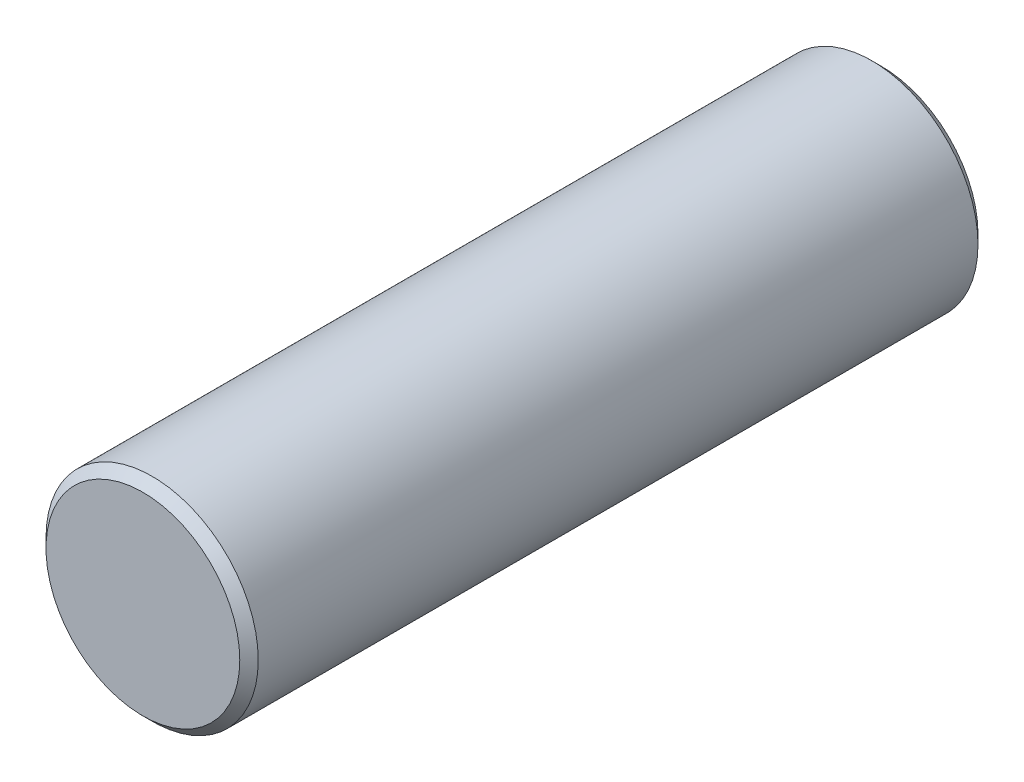
ISO-10303-21;
HEADER;
FILE_DESCRIPTION(('STEP AP214'),'2;1');
FILE_NAME('part.step','',(''),(''),'','','');
FILE_SCHEMA(('AUTOMOTIVE_DESIGN { 1 0 10303 214 1 1 1 1 }'));
ENDSEC;
DATA;
#1=APPLICATION_CONTEXT('core data for automotive mechanical design processes');
#2=APPLICATION_PROTOCOL_DEFINITION('international standard','automotive_design',2000,#1);
#3=PRODUCT_CONTEXT('',#1,'mechanical');
#4=PRODUCT('Part','Part','',(#3));
#5=PRODUCT_RELATED_PRODUCT_CATEGORY('part','',(#4));
#6=PRODUCT_DEFINITION_FORMATION('','',#4);
#7=PRODUCT_DEFINITION_CONTEXT('part definition',#1,'design');
#8=PRODUCT_DEFINITION('design','',#6,#7);
#9=PRODUCT_DEFINITION_SHAPE('','',#8);
#10=(LENGTH_UNIT() NAMED_UNIT(*) SI_UNIT(.MILLI.,.METRE.));
#11=(NAMED_UNIT(*) PLANE_ANGLE_UNIT() SI_UNIT($,.RADIAN.));
#12=(NAMED_UNIT(*) SI_UNIT($,.STERADIAN.) SOLID_ANGLE_UNIT());
#13=UNCERTAINTY_MEASURE_WITH_UNIT(LENGTH_MEASURE(1.E-05),#10,'distance_accuracy_value','');
#14=(GEOMETRIC_REPRESENTATION_CONTEXT(3) GLOBAL_UNCERTAINTY_ASSIGNED_CONTEXT((#13)) GLOBAL_UNIT_ASSIGNED_CONTEXT((#10,
#11,#12)) REPRESENTATION_CONTEXT('',''));
#15=CARTESIAN_POINT('',(0.,0.,0.));
#16=DIRECTION('',(0.,0.,1.));
#17=DIRECTION('',(1.,0.,0.));
#18=AXIS2_PLACEMENT_3D('',#15,#16,#17);
#19=CARTESIAN_POINT('',(0.,0.,80.));
#20=DIRECTION('',(0.,0.,-1.));
#21=DIRECTION('',(-1.,0.,0.));
#22=AXIS2_PLACEMENT_3D('',#19,#20,#21);
#23=CYLINDRICAL_SURFACE('',#22,11.5);
#24=CARTESIAN_POINT('',(0.,-11.5,12.5));
#25=CARTESIAN_POINT('',(-0.138677726510867,-11.4999974393954,12.5000047650593));
#26=CARTESIAN_POINT('',(-0.277413225798993,-11.4974660329192,12.5115778653683));
#27=CARTESIAN_POINT('',(-0.550944911814634,-11.4876122322648,12.5575172654708));
#28=CARTESIAN_POINT('',(-0.685738187177295,-11.4802863862567,12.5918999876431));
#29=CARTESIAN_POINT('',(-0.947392658892481,-11.4616595565263,12.6823319620601));
#30=CARTESIAN_POINT('',(-1.07426193195675,-11.4503627008652,12.738358720222));
#31=CARTESIAN_POINT('',(-1.31679476574259,-11.4250137521665,12.8704173196404));
#32=CARTESIAN_POINT('',(-1.43245864398416,-11.4109617372342,12.9464485938149));
#33=CARTESIAN_POINT('',(-1.65113687017526,-11.3813931566709,13.1176344210567));
#34=CARTESIAN_POINT('',(-1.75394802262851,-11.3658586111771,13.2130454595255));
#35=CARTESIAN_POINT('',(-1.94224066057478,-11.3352028008011,13.419731765165));
#36=CARTESIAN_POINT('',(-2.02772061581534,-11.3200815725146,13.5310084317099));
#37=CARTESIAN_POINT('',(-2.17981857275252,-11.2917873272943,13.7677666213762));
#38=CARTESIAN_POINT('',(-2.24622069514282,-11.2786373565009,13.8933898294737));
#39=CARTESIAN_POINT('',(-2.35689344435895,-11.2560323824766,14.1543447633211));
#40=CARTESIAN_POINT('',(-2.40116668282573,-11.2465769432475,14.2896753412548));
#41=CARTESIAN_POINT('',(-2.46565424770195,-11.2326146337362,14.564000615574));
#42=CARTESIAN_POINT('',(-2.48622809682875,-11.2280338974079,14.7029069567357));
#43=CARTESIAN_POINT('',(-2.50385066868686,-11.224117758739,14.9822694178629));
#44=CARTESIAN_POINT('',(-2.50090224659726,-11.2247817197868,15.1227253476697));
#45=CARTESIAN_POINT('',(-2.47185339460594,-11.2312130658968,15.3985303330358));
#46=CARTESIAN_POINT('',(-2.44617020684332,-11.2368884732507,15.5339258035832));
#47=CARTESIAN_POINT('',(-2.37304173275475,-11.2525578586622,15.7984391169997));
#48=CARTESIAN_POINT('',(-2.32559523883172,-11.262552076359,15.9275566110782));
#49=CARTESIAN_POINT('',(-2.20990273661165,-11.2858238749824,16.1770239439294));
#50=CARTESIAN_POINT('',(-2.14149592741319,-11.299126684358,16.2972967585815));
#51=CARTESIAN_POINT('',(-1.98593770795307,-11.3275012480038,16.5248108912239));
#52=CARTESIAN_POINT('',(-1.89878377203338,-11.3425732404982,16.6320504502931));
#53=CARTESIAN_POINT('',(-1.70599474463954,-11.3731828590882,16.8328565278636));
#54=CARTESIAN_POINT('',(-1.60000476027813,-11.3887235557419,16.9260821866942));
#55=CARTESIAN_POINT('',(-1.37371962098243,-11.4182263347737,17.0934903408643));
#56=CARTESIAN_POINT('',(-1.2534242130614,-11.4321883892255,17.1676724993525));
#57=CARTESIAN_POINT('',(-1.00152969205098,-11.4570051935706,17.2949705466554));
#58=CARTESIAN_POINT('',(-0.869907535370159,-11.4678534045306,17.3480421931409));
#59=CARTESIAN_POINT('',(-0.599325426676377,-11.4851715489049,17.4312207735909));
#60=CARTESIAN_POINT('',(-0.460366531487371,-11.4916421110548,17.4613310054456));
#61=CARTESIAN_POINT('',(-0.181979668046682,-11.4993865515895,17.497237238223));
#62=CARTESIAN_POINT('',(-0.0426144524251151,-11.5007599464758,17.5034989199804));
#63=CARTESIAN_POINT('',(0.235170665106804,-11.4984339982112,17.4927919147568));
#64=CARTESIAN_POINT('',(0.373590629688979,-11.4947349947164,17.4758247832151));
#65=CARTESIAN_POINT('',(0.644016073384049,-11.4827426393966,17.4195279881823));
#66=CARTESIAN_POINT('',(0.776074738455783,-11.474499412859,17.3804421831636));
#67=CARTESIAN_POINT('',(1.03176169777679,-11.4543411035207,17.2812879056093));
#68=CARTESIAN_POINT('',(1.15538927880089,-11.4424257105435,17.2212176605262));
#69=CARTESIAN_POINT('',(1.39263316867793,-11.4159991010029,17.0808266635118));
#70=CARTESIAN_POINT('',(1.50608338755975,-11.4014535932093,17.0002318373532));
#71=CARTESIAN_POINT('',(1.71801618519105,-11.3714509636298,16.8214408260479));
#72=CARTESIAN_POINT('',(1.81649684233745,-11.3559937251605,16.7232423846917));
#73=CARTESIAN_POINT('',(1.99753288574288,-11.325566641818,16.509895945322));
#74=CARTESIAN_POINT('',(2.07976600786432,-11.310610776988,16.3944721273747));
#75=CARTESIAN_POINT('',(2.22368179366391,-11.2832011420601,16.1511784809766));
#76=CARTESIAN_POINT('',(2.28536534273649,-11.2707472641715,16.0233091890558));
#77=CARTESIAN_POINT('',(2.38601708061676,-11.2498696486682,15.7594378304963));
#78=CARTESIAN_POINT('',(2.42511238575491,-11.2414234069624,15.6234861195921));
#79=CARTESIAN_POINT('',(2.47985131583715,-11.2294762446113,15.3467360653951));
#80=CARTESIAN_POINT('',(2.49549863846581,-11.2259745442301,15.2059384898656));
#81=CARTESIAN_POINT('',(2.50274155792603,-11.2243616472795,14.9267416820846));
#82=CARTESIAN_POINT('',(2.49484798386678,-11.2261359606195,14.7883561179246));
#83=CARTESIAN_POINT('',(2.45637409896547,-11.2346164742396,14.5149374255962));
#84=CARTESIAN_POINT('',(2.42579404874615,-11.2413226178626,14.3799042589337));
#85=CARTESIAN_POINT('',(2.34306069762792,-11.2588557046026,14.1174232556823));
#86=CARTESIAN_POINT('',(2.29098087550878,-11.2696686022834,13.9899512584669));
#87=CARTESIAN_POINT('',(2.16678978132844,-11.2942025369604,13.7454779715914));
#88=CARTESIAN_POINT('',(2.09467645168666,-11.3079238726391,13.6284777590893));
#89=CARTESIAN_POINT('',(1.93076731772525,-11.3370712566148,13.4057491676396));
#90=CARTESIAN_POINT('',(1.83860709857683,-11.3525258838354,13.3002926558253));
#91=CARTESIAN_POINT('',(1.6379598228856,-11.3832055192048,13.1061739240559));
#92=CARTESIAN_POINT('',(1.52946899955167,-11.3984304734839,13.0175155894261));
#93=CARTESIAN_POINT('',(1.29756952312687,-11.4271660141609,12.858426164179));
#94=CARTESIAN_POINT('',(1.17398793223281,-11.4406522029584,12.7882425109405));
#95=CARTESIAN_POINT('',(0.916515832604859,-11.4641462926135,12.6697541803902));
#96=CARTESIAN_POINT('',(0.782634129577163,-11.4741571251075,12.6214310521531));
#97=CARTESIAN_POINT('',(0.540505002079845,-11.4877745785232,12.5567031943277));
#98=CARTESIAN_POINT('',(0.433572829583092,-11.4923308317923,12.5354798687113));
#99=CARTESIAN_POINT('',(0.217772258186659,-11.4984444830369,12.5071267056324));
#100=CARTESIAN_POINT('',(0.108903943322476,-11.5000020108488,12.4999962579878));
#101=CARTESIAN_POINT('',(0.,-11.5,12.5));
#102=B_SPLINE_CURVE_WITH_KNOTS('',3,(#24,#25,#26,#27,#28,#29,#30,#31,#32,#33,#34,#35,#36,#37,
#38,#39,#40,#41,#42,#43,#44,#45,#46,#47,#48,#49,#50,#51,#52,#53,#54,#55,#56,#57,#58,#59,#60,#61,
#62,#63,#64,#65,#66,#67,#68,#69,#70,#71,#72,#73,#74,#75,#76,#77,#78,#79,#80,#81,#82,#83,#84,#85,
#86,#87,#88,#89,#90,#91,#92,#93,#94,#95,#96,#97,#98,#99,#100,#101),.UNSPECIFIED.,.T.,.F.,(4,2,2,
2,2,2,2,2,2,2,2,2,2,2,2,2,2,2,2,2,2,2,2,2,2,2,2,2,2,2,2,2,2,2,2,2,2,2,4),(0.,0.415634564336814,
0.831568700793519,1.24707172561509,1.66256297315068,2.08396070666694,2.50539563117213,
2.93142680189744,3.35740768073596,3.77683755102813,4.19621651088047,4.60805475084516,
5.01991584555553,5.43501926087914,5.85017863499902,6.27420298213808,6.69823482912452,
7.12315071646024,7.5480055626935,7.9645205989377,8.38100774601863,8.79299016056119,
9.2050073835186,9.62284481100336,10.0407358299606,10.4662282557997,10.8917023465929,
11.3147581376294,11.7377472068678,12.1516248228839,12.5654976843385,12.9779676302157,
13.390479955298,13.8112329668627,14.2320831777846,14.6583121167757,15.0841806317308,
15.4105935613291,15.73699235785),.UNSPECIFIED.);
#103=CARTESIAN_POINT('',(0.,-11.5,12.5));
#104=VERTEX_POINT('',#103);
#105=EDGE_CURVE('E11',#104,#104,#102,.T.);
#106=ORIENTED_EDGE('',*,*,#105,.T.);
#107=EDGE_LOOP('',(#106));
#108=FACE_BOUND('',#107,.T.);
#109=CARTESIAN_POINT('',(0.,0.,79.));
#110=DIRECTION('',(0.,0.,1.));
#111=DIRECTION('',(1.,0.,0.));
#112=AXIS2_PLACEMENT_3D('',#109,#110,#111);
#113=CIRCLE('',#112,11.5);
#114=CARTESIAN_POINT('',(11.5,0.,79.));
#115=VERTEX_POINT('',#114);
#116=EDGE_CURVE('E82',#115,#115,#113,.F.);
#117=ORIENTED_EDGE('',*,*,#116,.T.);
#118=EDGE_LOOP('',(#117));
#119=FACE_BOUND('',#118,.T.);
#120=CARTESIAN_POINT('',(0.,0.,1.00000000000004));
#121=DIRECTION('',(0.,0.,1.));
#122=DIRECTION('',(1.,0.,0.));
#123=AXIS2_PLACEMENT_3D('',#120,#121,#122);
#124=CIRCLE('',#123,11.5);
#125=CARTESIAN_POINT('',(11.5,0.,1.00000000000004));
#126=VERTEX_POINT('',#125);
#127=EDGE_CURVE('E77',#126,#126,#124,.T.);
#128=ORIENTED_EDGE('',*,*,#127,.T.);
#129=EDGE_LOOP('',(#128));
#130=FACE_BOUND('',#129,.T.);
#131=ADVANCED_FACE('F49',(#108,#119,#130),#23,.T.);
#132=CARTESIAN_POINT('',(0.,0.,80.));
#133=DIRECTION('',(0.,0.,1.));
#134=DIRECTION('',(1.,0.,0.));
#135=AXIS2_PLACEMENT_3D('',#132,#133,#134);
#136=PLANE('',#135);
#137=CARTESIAN_POINT('',(0.,0.,80.));
#138=DIRECTION('',(0.,0.,1.));
#139=DIRECTION('',(1.,0.,0.));
#140=AXIS2_PLACEMENT_3D('',#137,#138,#139);
#141=CIRCLE('',#140,10.5);
#142=CARTESIAN_POINT('',(10.5,0.,80.));
#143=VERTEX_POINT('',#142);
#144=EDGE_CURVE('E74',#143,#143,#141,.T.);
#145=ORIENTED_EDGE('',*,*,#144,.T.);
#146=EDGE_LOOP('',(#145));
#147=FACE_BOUND('',#146,.T.);
#148=ADVANCED_FACE('F95',(#147),#136,.T.);
#149=CARTESIAN_POINT('',(0.,0.,0.));
#150=DIRECTION('',(0.,0.,1.));
#151=DIRECTION('',(1.,0.,0.));
#152=AXIS2_PLACEMENT_3D('',#149,#150,#151);
#153=PLANE('',#152);
#154=CARTESIAN_POINT('',(0.,0.,0.));
#155=DIRECTION('',(0.,0.,1.));
#156=DIRECTION('',(1.,0.,0.));
#157=AXIS2_PLACEMENT_3D('',#154,#155,#156);
#158=CIRCLE('',#157,10.5);
#159=CARTESIAN_POINT('',(10.5,0.,0.));
#160=VERTEX_POINT('',#159);
#161=EDGE_CURVE('E62',#160,#160,#158,.F.);
#162=ORIENTED_EDGE('',*,*,#161,.T.);
#163=EDGE_LOOP('',(#162));
#164=FACE_BOUND('',#163,.T.);
#165=ADVANCED_FACE('F87',(#164),#153,.F.);
#166=CARTESIAN_POINT('',(0.,0.,80.));
#167=DIRECTION('',(0.,0.,-1.));
#168=DIRECTION('',(-1.,0.,0.));
#169=AXIS2_PLACEMENT_3D('',#166,#167,#168);
#170=CONICAL_SURFACE('',#169,10.5,0.785398163397447);
#171=ORIENTED_EDGE('',*,*,#116,.F.);
#172=EDGE_LOOP('',(#171));
#173=FACE_BOUND('',#172,.T.);
#174=ORIENTED_EDGE('',*,*,#144,.F.);
#175=EDGE_LOOP('',(#174));
#176=FACE_BOUND('',#175,.T.);
#177=ADVANCED_FACE('F91',(#173,#176),#170,.T.);
#178=CARTESIAN_POINT('',(0.,0.,1.00000000000004));
#179=DIRECTION('',(0.,0.,1.));
#180=DIRECTION('',(1.,0.,0.));
#181=AXIS2_PLACEMENT_3D('',#178,#179,#180);
#182=CONICAL_SURFACE('',#181,11.5,0.785398163397447);
#183=ORIENTED_EDGE('',*,*,#161,.F.);
#184=EDGE_LOOP('',(#183));
#185=FACE_BOUND('',#184,.T.);
#186=ORIENTED_EDGE('',*,*,#127,.F.);
#187=EDGE_LOOP('',(#186));
#188=FACE_BOUND('',#187,.T.);
#189=ADVANCED_FACE('F52',(#185,#188),#182,.T.);
#190=CARTESIAN_POINT('',(0.,-11.5,15.));
#191=DIRECTION('',(0.,-1.,0.));
#192=DIRECTION('',(0.,0.,-1.));
#193=AXIS2_PLACEMENT_3D('',#190,#191,#192);
#194=CYLINDRICAL_SURFACE('',#193,2.49999999999999);
#195=CARTESIAN_POINT('',(0.,0.,15.));
#196=DIRECTION('',(0.,-1.,0.));
#197=DIRECTION('',(0.,0.,-1.));
#198=AXIS2_PLACEMENT_3D('',#195,#196,#197);
#199=CIRCLE('',#198,2.5);
#200=CARTESIAN_POINT('',(0.,0.,12.5));
#201=VERTEX_POINT('',#200);
#202=EDGE_CURVE('E72',#201,#201,#199,.T.);
#203=ORIENTED_EDGE('',*,*,#202,.F.);
#204=EDGE_LOOP('',(#203));
#205=FACE_BOUND('',#204,.T.);
#206=ORIENTED_EDGE('',*,*,#105,.F.);
#207=EDGE_LOOP('',(#206));
#208=FACE_BOUND('',#207,.T.);
#209=ADVANCED_FACE('F68',(#205,#208),#194,.F.);
#210=CARTESIAN_POINT('',(0.,0.,15.));
#211=DIRECTION('',(0.,-1.,0.));
#212=DIRECTION('',(0.,0.,-1.));
#213=AXIS2_PLACEMENT_3D('',#210,#211,#212);
#214=CONICAL_SURFACE('',#213,2.5,1.02974425867665);
#215=CARTESIAN_POINT('',(0.,1.5021515475689,15.));
#216=VERTEX_POINT('',#215);
#217=VERTEX_LOOP('',#216);
#218=FACE_BOUND('',#217,.T.);
#219=ORIENTED_EDGE('',*,*,#202,.T.);
#220=EDGE_LOOP('',(#219));
#221=FACE_BOUND('',#220,.T.);
#222=ADVANCED_FACE('F65',(#218,#221),#214,.F.);
#223=CLOSED_SHELL('',(#131,#148,#165,#177,#189,#209,#222));
#224=MANIFOLD_SOLID_BREP('B2',#223);
#225=ADVANCED_BREP_SHAPE_REPRESENTATION('',(#18,#224),#14);
#226=SHAPE_DEFINITION_REPRESENTATION(#9,#225);
ENDSEC;
END-ISO-10303-21;
